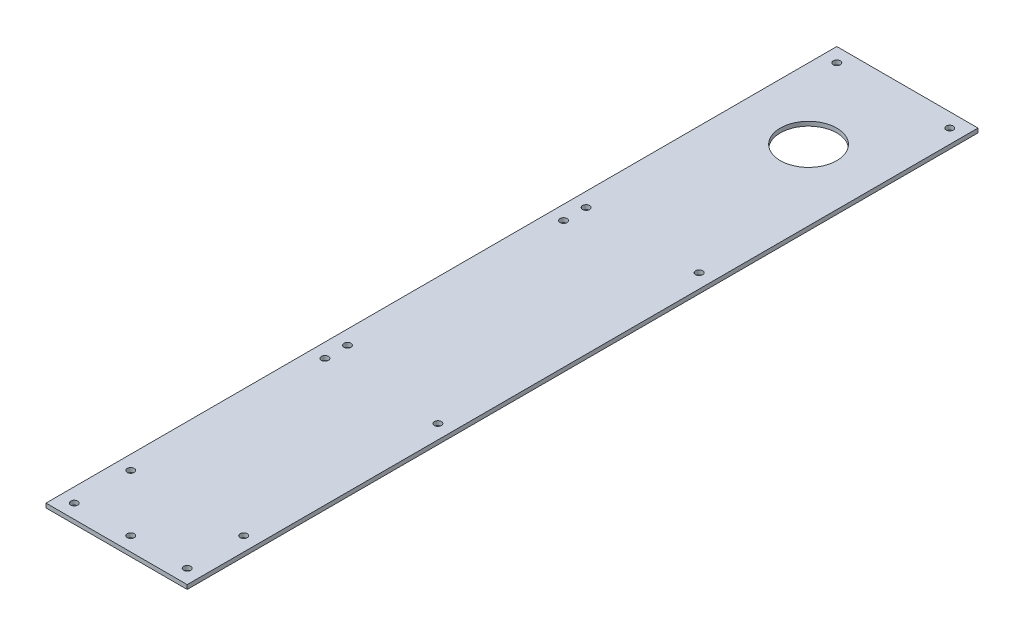
ISO-10303-21;
HEADER;
FILE_DESCRIPTION(('STEP AP214'),'2;1');
FILE_NAME('part.step','',(''),(''),'','','');
FILE_SCHEMA(('AUTOMOTIVE_DESIGN { 1 0 10303 214 1 1 1 1 }'));
ENDSEC;
DATA;
#1=APPLICATION_CONTEXT('core data for automotive mechanical design processes');
#2=APPLICATION_PROTOCOL_DEFINITION('international standard','automotive_design',2000,#1);
#3=PRODUCT_CONTEXT('',#1,'mechanical');
#4=PRODUCT('Part','Part','',(#3));
#5=PRODUCT_RELATED_PRODUCT_CATEGORY('part','',(#4));
#6=PRODUCT_DEFINITION_FORMATION('','',#4);
#7=PRODUCT_DEFINITION_CONTEXT('part definition',#1,'design');
#8=PRODUCT_DEFINITION('design','',#6,#7);
#9=PRODUCT_DEFINITION_SHAPE('','',#8);
#10=(LENGTH_UNIT() NAMED_UNIT(*) SI_UNIT(.MILLI.,.METRE.));
#11=(NAMED_UNIT(*) PLANE_ANGLE_UNIT() SI_UNIT($,.RADIAN.));
#12=(NAMED_UNIT(*) SI_UNIT($,.STERADIAN.) SOLID_ANGLE_UNIT());
#13=UNCERTAINTY_MEASURE_WITH_UNIT(LENGTH_MEASURE(1.E-05),#10,'distance_accuracy_value','');
#14=(GEOMETRIC_REPRESENTATION_CONTEXT(3) GLOBAL_UNCERTAINTY_ASSIGNED_CONTEXT((#13)) GLOBAL_UNIT_ASSIGNED_CONTEXT((#10,
#11,#12)) REPRESENTATION_CONTEXT('',''));
#15=CARTESIAN_POINT('',(0.,0.,0.));
#16=DIRECTION('',(0.,0.,1.));
#17=DIRECTION('',(1.,0.,0.));
#18=AXIS2_PLACEMENT_3D('',#15,#16,#17);
#19=CARTESIAN_POINT('',(0.,-3.,0.));
#20=DIRECTION('',(0.,-1.,0.));
#21=DIRECTION('',(1.,0.,0.));
#22=AXIS2_PLACEMENT_3D('',#19,#20,#21);
#23=PLANE('',#22);
#24=CARTESIAN_POINT('',(15.6410256410256,-3.,-405.897435897436));
#25=DIRECTION('',(0.,-1.,0.));
#26=DIRECTION('',(0.,0.,-1.));
#27=AXIS2_PLACEMENT_3D('',#24,#25,#26);
#28=CIRCLE('',#27,20.);
#29=CARTESIAN_POINT('',(15.6410256410256,-3.,-425.897435897436));
#30=VERTEX_POINT('',#29);
#31=EDGE_CURVE('E11',#30,#30,#28,.T.);
#32=ORIENTED_EDGE('',*,*,#31,.F.);
#33=EDGE_LOOP('',(#32));
#34=FACE_BOUND('',#33,.T.);
#35=CARTESIAN_POINT('',(15.6410256410256,-3.,74.102564102564));
#36=DIRECTION('',(0.,-1.,0.));
#37=DIRECTION('',(0.,0.,-1.));
#38=AXIS2_PLACEMENT_3D('',#35,#36,#37);
#39=CIRCLE('',#38,2.5);
#40=CARTESIAN_POINT('',(15.6410256410256,-3.,71.602564102564));
#41=VERTEX_POINT('',#40);
#42=EDGE_CURVE('E24',#41,#41,#39,.T.);
#43=ORIENTED_EDGE('',*,*,#42,.F.);
#44=EDGE_LOOP('',(#43));
#45=FACE_BOUND('',#44,.T.);
#46=DIRECTION('',(0.,0.,-1.));
#47=VECTOR('',#46,1.);
#48=CARTESIAN_POINT('',(-34.3589743589744,-3.,84.102564102564));
#49=LINE('',#48,#47);
#50=CARTESIAN_POINT('',(-34.3589743589744,-3.,84.102564102564));
#51=VERTEX_POINT('',#50);
#52=CARTESIAN_POINT('',(-34.3589743589743,-3.,-475.897435897436));
#53=VERTEX_POINT('',#52);
#54=EDGE_CURVE('E31',#51,#53,#49,.T.);
#55=ORIENTED_EDGE('',*,*,#54,.T.);
#56=DIRECTION('',(1.,0.,0.));
#57=VECTOR('',#56,1.);
#58=CARTESIAN_POINT('',(-34.3589743589743,-3.,-475.897435897436));
#59=LINE('',#58,#57);
#60=CARTESIAN_POINT('',(65.6410256410257,-3.,-475.897435897436));
#61=VERTEX_POINT('',#60);
#62=EDGE_CURVE('E36',#53,#61,#59,.T.);
#63=ORIENTED_EDGE('',*,*,#62,.T.);
#64=DIRECTION('',(0.,0.,1.));
#65=VECTOR('',#64,1.);
#66=CARTESIAN_POINT('',(65.6410256410256,-3.,84.102564102564));
#67=LINE('',#66,#65);
#68=CARTESIAN_POINT('',(65.6410256410256,-3.,84.102564102564));
#69=VERTEX_POINT('',#68);
#70=EDGE_CURVE('E163',#61,#69,#67,.T.);
#71=ORIENTED_EDGE('',*,*,#70,.T.);
#72=DIRECTION('',(-1.,0.,0.));
#73=VECTOR('',#72,1.);
#74=CARTESIAN_POINT('',(-34.3589743589744,-3.,84.102564102564));
#75=LINE('',#74,#73);
#76=EDGE_CURVE('E161',#69,#51,#75,.T.);
#77=ORIENTED_EDGE('',*,*,#76,.T.);
#78=EDGE_LOOP('',(#55,#63,#71,#77));
#79=FACE_BOUND('',#78,.T.);
#80=CARTESIAN_POINT('',(-24.3589743589744,-3.,74.102564102564));
#81=DIRECTION('',(0.,-1.,0.));
#82=DIRECTION('',(1.,0.,0.));
#83=AXIS2_PLACEMENT_3D('',#80,#81,#82);
#84=CIRCLE('',#83,2.5);
#85=CARTESIAN_POINT('',(-21.8589743589744,-3.,74.102564102564));
#86=VERTEX_POINT('',#85);
#87=EDGE_CURVE('E158',#86,#86,#84,.T.);
#88=ORIENTED_EDGE('',*,*,#87,.F.);
#89=EDGE_LOOP('',(#88));
#90=FACE_BOUND('',#89,.T.);
#91=CARTESIAN_POINT('',(-24.3589743589744,-3.,-465.897435897436));
#92=DIRECTION('',(0.,-1.,0.));
#93=DIRECTION('',(1.,0.,0.));
#94=AXIS2_PLACEMENT_3D('',#91,#92,#93);
#95=CIRCLE('',#94,2.5);
#96=CARTESIAN_POINT('',(-21.8589743589744,-3.,-465.897435897436));
#97=VERTEX_POINT('',#96);
#98=EDGE_CURVE('E155',#97,#97,#95,.T.);
#99=ORIENTED_EDGE('',*,*,#98,.F.);
#100=EDGE_LOOP('',(#99));
#101=FACE_BOUND('',#100,.T.);
#102=CARTESIAN_POINT('',(-24.3589743589744,-3.,-119.397435897436));
#103=DIRECTION('',(0.,-1.,0.));
#104=DIRECTION('',(1.,0.,0.));
#105=AXIS2_PLACEMENT_3D('',#102,#103,#104);
#106=CIRCLE('',#105,2.5);
#107=CARTESIAN_POINT('',(-21.8589743589744,-3.,-119.397435897436));
#108=VERTEX_POINT('',#107);
#109=EDGE_CURVE('E152',#108,#108,#106,.T.);
#110=ORIENTED_EDGE('',*,*,#109,.F.);
#111=EDGE_LOOP('',(#110));
#112=FACE_BOUND('',#111,.T.);
#113=CARTESIAN_POINT('',(-24.3589743589744,-3.,-272.397435897436));
#114=DIRECTION('',(0.,-1.,0.));
#115=DIRECTION('',(1.,0.,0.));
#116=AXIS2_PLACEMENT_3D('',#113,#114,#115);
#117=CIRCLE('',#116,2.5);
#118=CARTESIAN_POINT('',(-21.8589743589744,-3.,-272.397435897436));
#119=VERTEX_POINT('',#118);
#120=EDGE_CURVE('E149',#119,#119,#117,.T.);
#121=ORIENTED_EDGE('',*,*,#120,.F.);
#122=EDGE_LOOP('',(#121));
#123=FACE_BOUND('',#122,.T.);
#124=CARTESIAN_POINT('',(-24.3589743589744,-3.,-288.397435897436));
#125=DIRECTION('',(0.,-1.,0.));
#126=DIRECTION('',(1.,0.,0.));
#127=AXIS2_PLACEMENT_3D('',#124,#125,#126);
#128=CIRCLE('',#127,2.5);
#129=CARTESIAN_POINT('',(-21.8589743589744,-3.,-288.397435897436));
#130=VERTEX_POINT('',#129);
#131=EDGE_CURVE('E146',#130,#130,#128,.T.);
#132=ORIENTED_EDGE('',*,*,#131,.F.);
#133=EDGE_LOOP('',(#132));
#134=FACE_BOUND('',#133,.T.);
#135=CARTESIAN_POINT('',(-24.3589743589744,-3.,-103.397435897436));
#136=DIRECTION('',(0.,-1.,0.));
#137=DIRECTION('',(1.,0.,0.));
#138=AXIS2_PLACEMENT_3D('',#135,#136,#137);
#139=CIRCLE('',#138,2.5);
#140=CARTESIAN_POINT('',(-21.8589743589744,-3.,-103.397435897436));
#141=VERTEX_POINT('',#140);
#142=EDGE_CURVE('E143',#141,#141,#139,.T.);
#143=ORIENTED_EDGE('',*,*,#142,.F.);
#144=EDGE_LOOP('',(#143));
#145=FACE_BOUND('',#144,.T.);
#146=CARTESIAN_POINT('',(55.6410256410256,-3.,74.102564102564));
#147=DIRECTION('',(0.,1.,0.));
#148=DIRECTION('',(0.,0.,-1.));
#149=AXIS2_PLACEMENT_3D('',#146,#147,#148);
#150=CIRCLE('',#149,2.5);
#151=CARTESIAN_POINT('',(55.6410256410256,-3.,71.602564102564));
#152=VERTEX_POINT('',#151);
#153=EDGE_CURVE('E140',#152,#152,#150,.T.);
#154=ORIENTED_EDGE('',*,*,#153,.T.);
#155=EDGE_LOOP('',(#154));
#156=FACE_BOUND('',#155,.T.);
#157=CARTESIAN_POINT('',(55.6410256410257,-3.,-103.397435897436));
#158=DIRECTION('',(0.,1.,0.));
#159=DIRECTION('',(0.,0.,-1.));
#160=AXIS2_PLACEMENT_3D('',#157,#158,#159);
#161=CIRCLE('',#160,2.5);
#162=CARTESIAN_POINT('',(55.6410256410257,-3.,-105.897435897436));
#163=VERTEX_POINT('',#162);
#164=EDGE_CURVE('E137',#163,#163,#161,.T.);
#165=ORIENTED_EDGE('',*,*,#164,.T.);
#166=EDGE_LOOP('',(#165));
#167=FACE_BOUND('',#166,.T.);
#168=CARTESIAN_POINT('',(55.6410256410257,-3.,-288.397435897436));
#169=DIRECTION('',(0.,1.,0.));
#170=DIRECTION('',(0.,0.,-1.));
#171=AXIS2_PLACEMENT_3D('',#168,#169,#170);
#172=CIRCLE('',#171,2.5);
#173=CARTESIAN_POINT('',(55.6410256410257,-3.,-290.897435897436));
#174=VERTEX_POINT('',#173);
#175=EDGE_CURVE('E134',#174,#174,#172,.T.);
#176=ORIENTED_EDGE('',*,*,#175,.T.);
#177=EDGE_LOOP('',(#176));
#178=FACE_BOUND('',#177,.T.);
#179=CARTESIAN_POINT('',(55.6410256410258,-3.,-465.897435897436));
#180=DIRECTION('',(0.,1.,0.));
#181=DIRECTION('',(0.,0.,-1.));
#182=AXIS2_PLACEMENT_3D('',#179,#180,#181);
#183=CIRCLE('',#182,2.5);
#184=CARTESIAN_POINT('',(55.6410256410258,-3.,-468.397435897436));
#185=VERTEX_POINT('',#184);
#186=EDGE_CURVE('E131',#185,#185,#183,.T.);
#187=ORIENTED_EDGE('',*,*,#186,.T.);
#188=EDGE_LOOP('',(#187));
#189=FACE_BOUND('',#188,.T.);
#190=CARTESIAN_POINT('',(-24.3589743589744,-3.,34.102564102564));
#191=DIRECTION('',(0.,-1.,0.));
#192=DIRECTION('',(0.,0.,-1.));
#193=AXIS2_PLACEMENT_3D('',#190,#191,#192);
#194=CIRCLE('',#193,2.5);
#195=CARTESIAN_POINT('',(-24.3589743589744,-3.,31.602564102564));
#196=VERTEX_POINT('',#195);
#197=EDGE_CURVE('E128',#196,#196,#194,.T.);
#198=ORIENTED_EDGE('',*,*,#197,.F.);
#199=EDGE_LOOP('',(#198));
#200=FACE_BOUND('',#199,.T.);
#201=CARTESIAN_POINT('',(55.6410256410256,-3.,34.1025641025641));
#202=DIRECTION('',(0.,1.,0.));
#203=DIRECTION('',(0.,0.,-1.));
#204=AXIS2_PLACEMENT_3D('',#201,#202,#203);
#205=CIRCLE('',#204,2.5);
#206=CARTESIAN_POINT('',(55.6410256410256,-3.,31.602564102564));
#207=VERTEX_POINT('',#206);
#208=EDGE_CURVE('E125',#207,#207,#205,.T.);
#209=ORIENTED_EDGE('',*,*,#208,.T.);
#210=EDGE_LOOP('',(#209));
#211=FACE_BOUND('',#210,.T.);
#212=ADVANCED_FACE('F17',(#34,#45,#79,#90,#101,#112,#123,#134,#145,#156,#167,#178,#189,#200,
#211),#23,.T.);
#213=CARTESIAN_POINT('',(0.,0.,0.));
#214=DIRECTION('',(0.,-1.,0.));
#215=DIRECTION('',(1.,0.,0.));
#216=AXIS2_PLACEMENT_3D('',#213,#214,#215);
#217=PLANE('',#216);
#218=CARTESIAN_POINT('',(15.6410256410256,0.,-405.897435897436));
#219=DIRECTION('',(0.,-1.,0.));
#220=DIRECTION('',(0.,0.,-1.));
#221=AXIS2_PLACEMENT_3D('',#218,#219,#220);
#222=CIRCLE('',#221,20.);
#223=CARTESIAN_POINT('',(15.6410256410256,0.,-425.897435897436));
#224=VERTEX_POINT('',#223);
#225=EDGE_CURVE('E122',#224,#224,#222,.T.);
#226=ORIENTED_EDGE('',*,*,#225,.T.);
#227=EDGE_LOOP('',(#226));
#228=FACE_BOUND('',#227,.T.);
#229=CARTESIAN_POINT('',(15.6410256410256,0.,74.102564102564));
#230=DIRECTION('',(0.,-1.,0.));
#231=DIRECTION('',(0.,0.,-1.));
#232=AXIS2_PLACEMENT_3D('',#229,#230,#231);
#233=CIRCLE('',#232,2.5);
#234=CARTESIAN_POINT('',(15.6410256410256,0.,71.602564102564));
#235=VERTEX_POINT('',#234);
#236=EDGE_CURVE('E119',#235,#235,#233,.T.);
#237=ORIENTED_EDGE('',*,*,#236,.T.);
#238=EDGE_LOOP('',(#237));
#239=FACE_BOUND('',#238,.T.);
#240=CARTESIAN_POINT('',(-24.3589743589744,0.,34.102564102564));
#241=DIRECTION('',(0.,-1.,0.));
#242=DIRECTION('',(0.,0.,-1.));
#243=AXIS2_PLACEMENT_3D('',#240,#241,#242);
#244=CIRCLE('',#243,2.5);
#245=CARTESIAN_POINT('',(-24.3589743589744,0.,31.602564102564));
#246=VERTEX_POINT('',#245);
#247=EDGE_CURVE('E116',#246,#246,#244,.T.);
#248=ORIENTED_EDGE('',*,*,#247,.T.);
#249=EDGE_LOOP('',(#248));
#250=FACE_BOUND('',#249,.T.);
#251=CARTESIAN_POINT('',(55.6410256410258,0.,-465.897435897436));
#252=DIRECTION('',(0.,-1.,0.));
#253=DIRECTION('',(0.,0.,-1.));
#254=AXIS2_PLACEMENT_3D('',#251,#252,#253);
#255=CIRCLE('',#254,2.5);
#256=CARTESIAN_POINT('',(55.6410256410258,0.,-468.397435897436));
#257=VERTEX_POINT('',#256);
#258=EDGE_CURVE('E113',#257,#257,#255,.F.);
#259=ORIENTED_EDGE('',*,*,#258,.F.);
#260=EDGE_LOOP('',(#259));
#261=FACE_BOUND('',#260,.T.);
#262=CARTESIAN_POINT('',(55.6410256410257,0.,-288.397435897436));
#263=DIRECTION('',(0.,-1.,0.));
#264=DIRECTION('',(0.,0.,-1.));
#265=AXIS2_PLACEMENT_3D('',#262,#263,#264);
#266=CIRCLE('',#265,2.5);
#267=CARTESIAN_POINT('',(55.6410256410257,0.,-290.897435897436));
#268=VERTEX_POINT('',#267);
#269=EDGE_CURVE('E110',#268,#268,#266,.F.);
#270=ORIENTED_EDGE('',*,*,#269,.F.);
#271=EDGE_LOOP('',(#270));
#272=FACE_BOUND('',#271,.T.);
#273=CARTESIAN_POINT('',(55.6410256410257,0.,-103.397435897436));
#274=DIRECTION('',(0.,-1.,0.));
#275=DIRECTION('',(0.,0.,-1.));
#276=AXIS2_PLACEMENT_3D('',#273,#274,#275);
#277=CIRCLE('',#276,2.5);
#278=CARTESIAN_POINT('',(55.6410256410257,0.,-105.897435897436));
#279=VERTEX_POINT('',#278);
#280=EDGE_CURVE('E107',#279,#279,#277,.F.);
#281=ORIENTED_EDGE('',*,*,#280,.F.);
#282=EDGE_LOOP('',(#281));
#283=FACE_BOUND('',#282,.T.);
#284=CARTESIAN_POINT('',(55.6410256410256,0.,74.102564102564));
#285=DIRECTION('',(0.,-1.,0.));
#286=DIRECTION('',(0.,0.,-1.));
#287=AXIS2_PLACEMENT_3D('',#284,#285,#286);
#288=CIRCLE('',#287,2.5);
#289=CARTESIAN_POINT('',(55.6410256410256,0.,71.602564102564));
#290=VERTEX_POINT('',#289);
#291=EDGE_CURVE('E104',#290,#290,#288,.F.);
#292=ORIENTED_EDGE('',*,*,#291,.F.);
#293=EDGE_LOOP('',(#292));
#294=FACE_BOUND('',#293,.T.);
#295=CARTESIAN_POINT('',(-24.3589743589744,0.,-103.397435897436));
#296=DIRECTION('',(0.,-1.,0.));
#297=DIRECTION('',(1.,0.,0.));
#298=AXIS2_PLACEMENT_3D('',#295,#296,#297);
#299=CIRCLE('',#298,2.5);
#300=CARTESIAN_POINT('',(-21.8589743589744,0.,-103.397435897436));
#301=VERTEX_POINT('',#300);
#302=EDGE_CURVE('E101',#301,#301,#299,.T.);
#303=ORIENTED_EDGE('',*,*,#302,.T.);
#304=EDGE_LOOP('',(#303));
#305=FACE_BOUND('',#304,.T.);
#306=CARTESIAN_POINT('',(-24.3589743589744,0.,-288.397435897436));
#307=DIRECTION('',(0.,-1.,0.));
#308=DIRECTION('',(1.,0.,0.));
#309=AXIS2_PLACEMENT_3D('',#306,#307,#308);
#310=CIRCLE('',#309,2.5);
#311=CARTESIAN_POINT('',(-21.8589743589744,0.,-288.397435897436));
#312=VERTEX_POINT('',#311);
#313=EDGE_CURVE('E98',#312,#312,#310,.T.);
#314=ORIENTED_EDGE('',*,*,#313,.T.);
#315=EDGE_LOOP('',(#314));
#316=FACE_BOUND('',#315,.T.);
#317=CARTESIAN_POINT('',(-24.3589743589744,0.,-272.397435897436));
#318=DIRECTION('',(0.,-1.,0.));
#319=DIRECTION('',(1.,0.,0.));
#320=AXIS2_PLACEMENT_3D('',#317,#318,#319);
#321=CIRCLE('',#320,2.5);
#322=CARTESIAN_POINT('',(-21.8589743589744,0.,-272.397435897436));
#323=VERTEX_POINT('',#322);
#324=EDGE_CURVE('E95',#323,#323,#321,.T.);
#325=ORIENTED_EDGE('',*,*,#324,.T.);
#326=EDGE_LOOP('',(#325));
#327=FACE_BOUND('',#326,.T.);
#328=CARTESIAN_POINT('',(-24.3589743589744,0.,-119.397435897436));
#329=DIRECTION('',(0.,-1.,0.));
#330=DIRECTION('',(1.,0.,0.));
#331=AXIS2_PLACEMENT_3D('',#328,#329,#330);
#332=CIRCLE('',#331,2.5);
#333=CARTESIAN_POINT('',(-21.8589743589744,0.,-119.397435897436));
#334=VERTEX_POINT('',#333);
#335=EDGE_CURVE('E92',#334,#334,#332,.T.);
#336=ORIENTED_EDGE('',*,*,#335,.T.);
#337=EDGE_LOOP('',(#336));
#338=FACE_BOUND('',#337,.T.);
#339=CARTESIAN_POINT('',(-24.3589743589744,0.,-465.897435897436));
#340=DIRECTION('',(0.,-1.,0.));
#341=DIRECTION('',(1.,0.,0.));
#342=AXIS2_PLACEMENT_3D('',#339,#340,#341);
#343=CIRCLE('',#342,2.5);
#344=CARTESIAN_POINT('',(-21.8589743589744,0.,-465.897435897436));
#345=VERTEX_POINT('',#344);
#346=EDGE_CURVE('E89',#345,#345,#343,.T.);
#347=ORIENTED_EDGE('',*,*,#346,.T.);
#348=EDGE_LOOP('',(#347));
#349=FACE_BOUND('',#348,.T.);
#350=CARTESIAN_POINT('',(-24.3589743589744,0.,74.102564102564));
#351=DIRECTION('',(0.,-1.,0.));
#352=DIRECTION('',(1.,0.,0.));
#353=AXIS2_PLACEMENT_3D('',#350,#351,#352);
#354=CIRCLE('',#353,2.5);
#355=CARTESIAN_POINT('',(-21.8589743589744,0.,74.102564102564));
#356=VERTEX_POINT('',#355);
#357=EDGE_CURVE('E74',#356,#356,#354,.T.);
#358=ORIENTED_EDGE('',*,*,#357,.T.);
#359=EDGE_LOOP('',(#358));
#360=FACE_BOUND('',#359,.T.);
#361=DIRECTION('',(0.,0.,-1.));
#362=VECTOR('',#361,1.);
#363=CARTESIAN_POINT('',(-34.3589743589744,0.,84.102564102564));
#364=LINE('',#363,#362);
#365=CARTESIAN_POINT('',(-34.3589743589744,0.,84.102564102564));
#366=VERTEX_POINT('',#365);
#367=CARTESIAN_POINT('',(-34.3589743589743,0.,-475.897435897436));
#368=VERTEX_POINT('',#367);
#369=EDGE_CURVE('E59',#366,#368,#364,.T.);
#370=ORIENTED_EDGE('',*,*,#369,.F.);
#371=DIRECTION('',(-1.,0.,0.));
#372=VECTOR('',#371,1.);
#373=CARTESIAN_POINT('',(-34.3589743589744,0.,84.102564102564));
#374=LINE('',#373,#372);
#375=CARTESIAN_POINT('',(65.6410256410256,0.,84.102564102564));
#376=VERTEX_POINT('',#375);
#377=EDGE_CURVE('E75',#376,#366,#374,.T.);
#378=ORIENTED_EDGE('',*,*,#377,.F.);
#379=DIRECTION('',(0.,0.,1.));
#380=VECTOR('',#379,1.);
#381=CARTESIAN_POINT('',(65.6410256410256,0.,84.102564102564));
#382=LINE('',#381,#380);
#383=CARTESIAN_POINT('',(65.6410256410257,0.,-475.897435897436));
#384=VERTEX_POINT('',#383);
#385=EDGE_CURVE('E62',#384,#376,#382,.T.);
#386=ORIENTED_EDGE('',*,*,#385,.F.);
#387=DIRECTION('',(1.,0.,0.));
#388=VECTOR('',#387,1.);
#389=CARTESIAN_POINT('',(-34.3589743589743,0.,-475.897435897436));
#390=LINE('',#389,#388);
#391=EDGE_CURVE('E55',#368,#384,#390,.T.);
#392=ORIENTED_EDGE('',*,*,#391,.F.);
#393=EDGE_LOOP('',(#370,#378,#386,#392));
#394=FACE_BOUND('',#393,.T.);
#395=CARTESIAN_POINT('',(55.6410256410256,0.,34.1025641025641));
#396=DIRECTION('',(0.,-1.,0.));
#397=DIRECTION('',(0.,0.,-1.));
#398=AXIS2_PLACEMENT_3D('',#395,#396,#397);
#399=CIRCLE('',#398,2.5);
#400=CARTESIAN_POINT('',(55.6410256410256,0.,31.602564102564));
#401=VERTEX_POINT('',#400);
#402=EDGE_CURVE('E66',#401,#401,#399,.F.);
#403=ORIENTED_EDGE('',*,*,#402,.F.);
#404=EDGE_LOOP('',(#403));
#405=FACE_BOUND('',#404,.T.);
#406=ADVANCED_FACE('F57',(#228,#239,#250,#261,#272,#283,#294,#305,#316,#327,#338,#349,#360,#394,
#405),#217,.F.);
#407=CARTESIAN_POINT('',(-34.3589743589744,-3.,84.102564102564));
#408=DIRECTION('',(1.,0.,0.));
#409=DIRECTION('',(0.,0.,1.));
#410=AXIS2_PLACEMENT_3D('',#407,#408,#409);
#411=PLANE('',#410);
#412=ORIENTED_EDGE('',*,*,#369,.T.);
#413=DIRECTION('',(0.,1.,0.));
#414=VECTOR('',#413,1.);
#415=CARTESIAN_POINT('',(-34.3589743589743,-3.,-475.897435897436));
#416=LINE('',#415,#414);
#417=EDGE_CURVE('E70',#53,#368,#416,.T.);
#418=ORIENTED_EDGE('',*,*,#417,.F.);
#419=ORIENTED_EDGE('',*,*,#54,.F.);
#420=DIRECTION('',(0.,1.,0.));
#421=VECTOR('',#420,1.);
#422=CARTESIAN_POINT('',(-34.3589743589744,-3.,84.102564102564));
#423=LINE('',#422,#421);
#424=EDGE_CURVE('E72',#51,#366,#423,.T.);
#425=ORIENTED_EDGE('',*,*,#424,.T.);
#426=EDGE_LOOP('',(#412,#418,#419,#425));
#427=FACE_BOUND('',#426,.T.);
#428=ADVANCED_FACE('F69',(#427),#411,.F.);
#429=CARTESIAN_POINT('',(-34.3589743589743,-3.,-475.897435897436));
#430=DIRECTION('',(0.,0.,1.));
#431=DIRECTION('',(0.,-1.,0.));
#432=AXIS2_PLACEMENT_3D('',#429,#430,#431);
#433=PLANE('',#432);
#434=ORIENTED_EDGE('',*,*,#391,.T.);
#435=DIRECTION('',(0.,1.,0.));
#436=VECTOR('',#435,1.);
#437=CARTESIAN_POINT('',(65.6410256410257,-3.,-475.897435897436));
#438=LINE('',#437,#436);
#439=EDGE_CURVE('E81',#61,#384,#438,.T.);
#440=ORIENTED_EDGE('',*,*,#439,.F.);
#441=ORIENTED_EDGE('',*,*,#62,.F.);
#442=ORIENTED_EDGE('',*,*,#417,.T.);
#443=EDGE_LOOP('',(#434,#440,#441,#442));
#444=FACE_BOUND('',#443,.T.);
#445=ADVANCED_FACE('F77',(#444),#433,.F.);
#446=CARTESIAN_POINT('',(-34.3589743589744,-3.,84.102564102564));
#447=DIRECTION('',(0.,0.,-1.));
#448=DIRECTION('',(0.,1.,0.));
#449=AXIS2_PLACEMENT_3D('',#446,#447,#448);
#450=PLANE('',#449);
#451=ORIENTED_EDGE('',*,*,#377,.T.);
#452=ORIENTED_EDGE('',*,*,#424,.F.);
#453=ORIENTED_EDGE('',*,*,#76,.F.);
#454=DIRECTION('',(0.,1.,0.));
#455=VECTOR('',#454,1.);
#456=CARTESIAN_POINT('',(65.6410256410256,-3.,84.102564102564));
#457=LINE('',#456,#455);
#458=EDGE_CURVE('E440',#69,#376,#457,.T.);
#459=ORIENTED_EDGE('',*,*,#458,.T.);
#460=EDGE_LOOP('',(#451,#452,#453,#459));
#461=FACE_BOUND('',#460,.T.);
#462=ADVANCED_FACE('F216',(#461),#450,.F.);
#463=CARTESIAN_POINT('',(-24.3589743589744,0.,74.102564102564));
#464=DIRECTION('',(0.,-1.,0.));
#465=DIRECTION('',(1.,0.,0.));
#466=AXIS2_PLACEMENT_3D('',#463,#464,#465);
#467=CYLINDRICAL_SURFACE('',#466,2.5);
#468=ORIENTED_EDGE('',*,*,#87,.T.);
#469=EDGE_LOOP('',(#468));
#470=FACE_BOUND('',#469,.T.);
#471=ORIENTED_EDGE('',*,*,#357,.F.);
#472=EDGE_LOOP('',(#471));
#473=FACE_BOUND('',#472,.T.);
#474=ADVANCED_FACE('F219',(#470,#473),#467,.F.);
#475=CARTESIAN_POINT('',(-24.3589743589744,0.,-465.897435897436));
#476=DIRECTION('',(0.,-1.,0.));
#477=DIRECTION('',(1.,0.,0.));
#478=AXIS2_PLACEMENT_3D('',#475,#476,#477);
#479=CYLINDRICAL_SURFACE('',#478,2.5);
#480=ORIENTED_EDGE('',*,*,#98,.T.);
#481=EDGE_LOOP('',(#480));
#482=FACE_BOUND('',#481,.T.);
#483=ORIENTED_EDGE('',*,*,#346,.F.);
#484=EDGE_LOOP('',(#483));
#485=FACE_BOUND('',#484,.T.);
#486=ADVANCED_FACE('F223',(#482,#485),#479,.F.);
#487=CARTESIAN_POINT('',(-24.3589743589744,0.,-119.397435897436));
#488=DIRECTION('',(0.,-1.,0.));
#489=DIRECTION('',(1.,0.,0.));
#490=AXIS2_PLACEMENT_3D('',#487,#488,#489);
#491=CYLINDRICAL_SURFACE('',#490,2.5);
#492=ORIENTED_EDGE('',*,*,#109,.T.);
#493=EDGE_LOOP('',(#492));
#494=FACE_BOUND('',#493,.T.);
#495=ORIENTED_EDGE('',*,*,#335,.F.);
#496=EDGE_LOOP('',(#495));
#497=FACE_BOUND('',#496,.T.);
#498=ADVANCED_FACE('F227',(#494,#497),#491,.F.);
#499=CARTESIAN_POINT('',(-24.3589743589744,0.,-272.397435897436));
#500=DIRECTION('',(0.,-1.,0.));
#501=DIRECTION('',(1.,0.,0.));
#502=AXIS2_PLACEMENT_3D('',#499,#500,#501);
#503=CYLINDRICAL_SURFACE('',#502,2.5);
#504=ORIENTED_EDGE('',*,*,#120,.T.);
#505=EDGE_LOOP('',(#504));
#506=FACE_BOUND('',#505,.T.);
#507=ORIENTED_EDGE('',*,*,#324,.F.);
#508=EDGE_LOOP('',(#507));
#509=FACE_BOUND('',#508,.T.);
#510=ADVANCED_FACE('F231',(#506,#509),#503,.F.);
#511=CARTESIAN_POINT('',(-24.3589743589744,0.,-288.397435897436));
#512=DIRECTION('',(0.,-1.,0.));
#513=DIRECTION('',(1.,0.,0.));
#514=AXIS2_PLACEMENT_3D('',#511,#512,#513);
#515=CYLINDRICAL_SURFACE('',#514,2.5);
#516=ORIENTED_EDGE('',*,*,#131,.T.);
#517=EDGE_LOOP('',(#516));
#518=FACE_BOUND('',#517,.T.);
#519=ORIENTED_EDGE('',*,*,#313,.F.);
#520=EDGE_LOOP('',(#519));
#521=FACE_BOUND('',#520,.T.);
#522=ADVANCED_FACE('F235',(#518,#521),#515,.F.);
#523=CARTESIAN_POINT('',(-24.3589743589744,0.,-103.397435897436));
#524=DIRECTION('',(0.,-1.,0.));
#525=DIRECTION('',(1.,0.,0.));
#526=AXIS2_PLACEMENT_3D('',#523,#524,#525);
#527=CYLINDRICAL_SURFACE('',#526,2.5);
#528=ORIENTED_EDGE('',*,*,#142,.T.);
#529=EDGE_LOOP('',(#528));
#530=FACE_BOUND('',#529,.T.);
#531=ORIENTED_EDGE('',*,*,#302,.F.);
#532=EDGE_LOOP('',(#531));
#533=FACE_BOUND('',#532,.T.);
#534=ADVANCED_FACE('F239',(#530,#533),#527,.F.);
#535=CARTESIAN_POINT('',(65.6410256410256,-3.,84.102564102564));
#536=DIRECTION('',(-1.,0.,0.));
#537=DIRECTION('',(0.,0.,-1.));
#538=AXIS2_PLACEMENT_3D('',#535,#536,#537);
#539=PLANE('',#538);
#540=ORIENTED_EDGE('',*,*,#385,.T.);
#541=ORIENTED_EDGE('',*,*,#458,.F.);
#542=ORIENTED_EDGE('',*,*,#70,.F.);
#543=ORIENTED_EDGE('',*,*,#439,.T.);
#544=EDGE_LOOP('',(#540,#541,#542,#543));
#545=FACE_BOUND('',#544,.T.);
#546=ADVANCED_FACE('F243',(#545),#539,.F.);
#547=CARTESIAN_POINT('',(55.6410256410256,22.,74.102564102564));
#548=DIRECTION('',(0.,-1.,0.));
#549=DIRECTION('',(0.,0.,-1.));
#550=AXIS2_PLACEMENT_3D('',#547,#548,#549);
#551=CYLINDRICAL_SURFACE('',#550,2.5);
#552=ORIENTED_EDGE('',*,*,#153,.F.);
#553=EDGE_LOOP('',(#552));
#554=FACE_BOUND('',#553,.T.);
#555=ORIENTED_EDGE('',*,*,#291,.T.);
#556=EDGE_LOOP('',(#555));
#557=FACE_BOUND('',#556,.T.);
#558=ADVANCED_FACE('F247',(#554,#557),#551,.F.);
#559=CARTESIAN_POINT('',(55.6410256410257,22.,-103.397435897436));
#560=DIRECTION('',(0.,-1.,0.));
#561=DIRECTION('',(0.,0.,-1.));
#562=AXIS2_PLACEMENT_3D('',#559,#560,#561);
#563=CYLINDRICAL_SURFACE('',#562,2.5);
#564=ORIENTED_EDGE('',*,*,#164,.F.);
#565=EDGE_LOOP('',(#564));
#566=FACE_BOUND('',#565,.T.);
#567=ORIENTED_EDGE('',*,*,#280,.T.);
#568=EDGE_LOOP('',(#567));
#569=FACE_BOUND('',#568,.T.);
#570=ADVANCED_FACE('F251',(#566,#569),#563,.F.);
#571=CARTESIAN_POINT('',(55.6410256410257,22.,-288.397435897436));
#572=DIRECTION('',(0.,-1.,0.));
#573=DIRECTION('',(0.,0.,-1.));
#574=AXIS2_PLACEMENT_3D('',#571,#572,#573);
#575=CYLINDRICAL_SURFACE('',#574,2.5);
#576=ORIENTED_EDGE('',*,*,#175,.F.);
#577=EDGE_LOOP('',(#576));
#578=FACE_BOUND('',#577,.T.);
#579=ORIENTED_EDGE('',*,*,#269,.T.);
#580=EDGE_LOOP('',(#579));
#581=FACE_BOUND('',#580,.T.);
#582=ADVANCED_FACE('F255',(#578,#581),#575,.F.);
#583=CARTESIAN_POINT('',(55.6410256410258,22.,-465.897435897436));
#584=DIRECTION('',(0.,-1.,0.));
#585=DIRECTION('',(0.,0.,-1.));
#586=AXIS2_PLACEMENT_3D('',#583,#584,#585);
#587=CYLINDRICAL_SURFACE('',#586,2.5);
#588=ORIENTED_EDGE('',*,*,#186,.F.);
#589=EDGE_LOOP('',(#588));
#590=FACE_BOUND('',#589,.T.);
#591=ORIENTED_EDGE('',*,*,#258,.T.);
#592=EDGE_LOOP('',(#591));
#593=FACE_BOUND('',#592,.T.);
#594=ADVANCED_FACE('F259',(#590,#593),#587,.F.);
#595=CARTESIAN_POINT('',(-24.3589743589744,22.,34.102564102564));
#596=DIRECTION('',(0.,-1.,0.));
#597=DIRECTION('',(0.,0.,-1.));
#598=AXIS2_PLACEMENT_3D('',#595,#596,#597);
#599=CYLINDRICAL_SURFACE('',#598,2.5);
#600=ORIENTED_EDGE('',*,*,#197,.T.);
#601=EDGE_LOOP('',(#600));
#602=FACE_BOUND('',#601,.T.);
#603=ORIENTED_EDGE('',*,*,#247,.F.);
#604=EDGE_LOOP('',(#603));
#605=FACE_BOUND('',#604,.T.);
#606=ADVANCED_FACE('F202',(#602,#605),#599,.F.);
#607=CARTESIAN_POINT('',(55.6410256410256,22.,34.1025641025641));
#608=DIRECTION('',(0.,-1.,0.));
#609=DIRECTION('',(0.,0.,-1.));
#610=AXIS2_PLACEMENT_3D('',#607,#608,#609);
#611=CYLINDRICAL_SURFACE('',#610,2.5);
#612=ORIENTED_EDGE('',*,*,#208,.F.);
#613=EDGE_LOOP('',(#612));
#614=FACE_BOUND('',#613,.T.);
#615=ORIENTED_EDGE('',*,*,#402,.T.);
#616=EDGE_LOOP('',(#615));
#617=FACE_BOUND('',#616,.T.);
#618=ADVANCED_FACE('F199',(#614,#617),#611,.F.);
#619=CARTESIAN_POINT('',(15.6410256410256,22.,74.102564102564));
#620=DIRECTION('',(0.,-1.,0.));
#621=DIRECTION('',(0.,0.,-1.));
#622=AXIS2_PLACEMENT_3D('',#619,#620,#621);
#623=CYLINDRICAL_SURFACE('',#622,2.5);
#624=ORIENTED_EDGE('',*,*,#42,.T.);
#625=EDGE_LOOP('',(#624));
#626=FACE_BOUND('',#625,.T.);
#627=ORIENTED_EDGE('',*,*,#236,.F.);
#628=EDGE_LOOP('',(#627));
#629=FACE_BOUND('',#628,.T.);
#630=ADVANCED_FACE('F169',(#626,#629),#623,.F.);
#631=CARTESIAN_POINT('',(15.6410256410256,22.,-405.897435897436));
#632=DIRECTION('',(0.,-1.,0.));
#633=DIRECTION('',(0.,0.,-1.));
#634=AXIS2_PLACEMENT_3D('',#631,#632,#633);
#635=CYLINDRICAL_SURFACE('',#634,20.);
#636=ORIENTED_EDGE('',*,*,#31,.T.);
#637=EDGE_LOOP('',(#636));
#638=FACE_BOUND('',#637,.T.);
#639=ORIENTED_EDGE('',*,*,#225,.F.);
#640=EDGE_LOOP('',(#639));
#641=FACE_BOUND('',#640,.T.);
#642=ADVANCED_FACE('F269',(#638,#641),#635,.F.);
#643=CLOSED_SHELL('',(#212,#406,#428,#445,#462,#474,#486,#498,#510,#522,#534,#546,#558,#570,
#582,#594,#606,#618,#630,#642));
#644=MANIFOLD_SOLID_BREP('B1',#643);
#645=ADVANCED_BREP_SHAPE_REPRESENTATION('',(#18,#644),#14);
#646=SHAPE_DEFINITION_REPRESENTATION(#9,#645);
ENDSEC;
END-ISO-10303-21;
